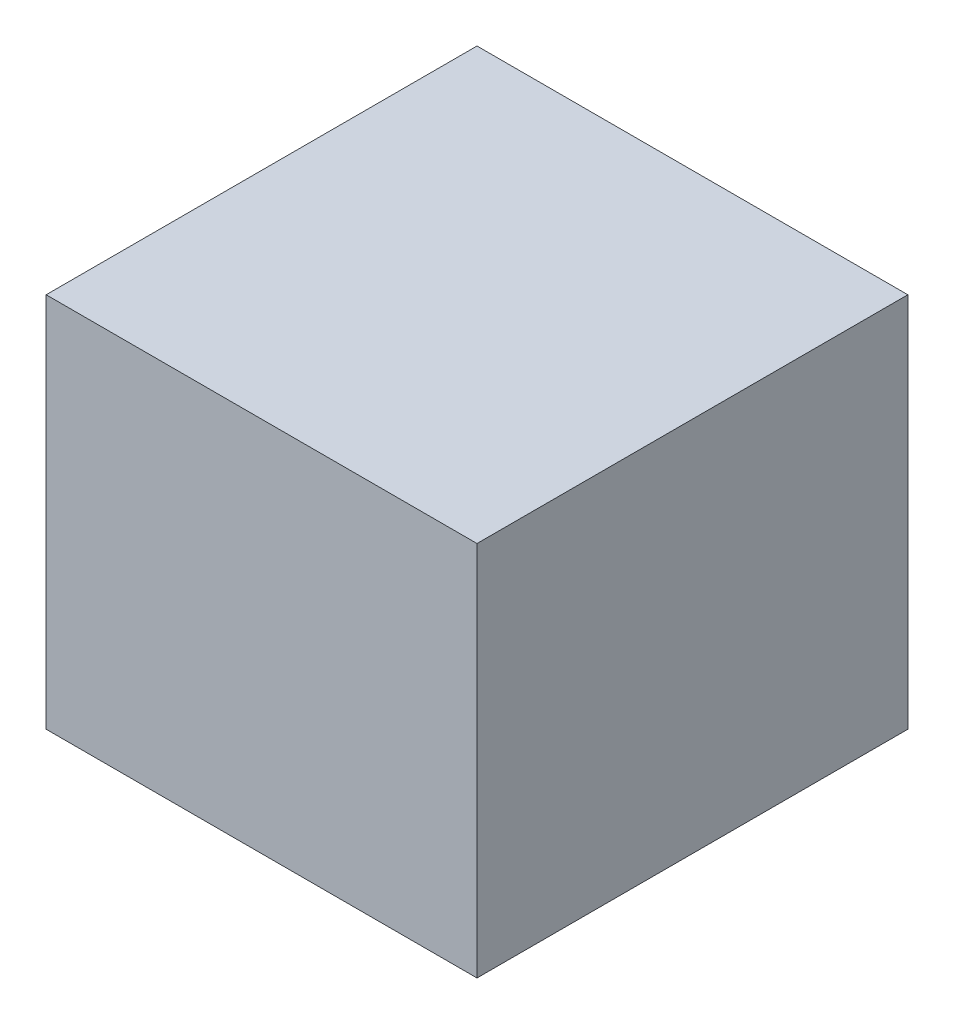
ISO-10303-21;
HEADER;
FILE_DESCRIPTION(('STEP AP214'),'2;1');
FILE_NAME('part.step','',(''),(''),'','','');
FILE_SCHEMA(('AUTOMOTIVE_DESIGN { 1 0 10303 214 1 1 1 1 }'));
ENDSEC;
DATA;
#1=APPLICATION_CONTEXT('core data for automotive mechanical design processes');
#2=APPLICATION_PROTOCOL_DEFINITION('international standard','automotive_design',2000,#1);
#3=PRODUCT_CONTEXT('',#1,'mechanical');
#4=PRODUCT('Part','Part','',(#3));
#5=PRODUCT_RELATED_PRODUCT_CATEGORY('part','',(#4));
#6=PRODUCT_DEFINITION_FORMATION('','',#4);
#7=PRODUCT_DEFINITION_CONTEXT('part definition',#1,'design');
#8=PRODUCT_DEFINITION('design','',#6,#7);
#9=PRODUCT_DEFINITION_SHAPE('','',#8);
#10=(LENGTH_UNIT() NAMED_UNIT(*) SI_UNIT(.MILLI.,.METRE.));
#11=(NAMED_UNIT(*) PLANE_ANGLE_UNIT() SI_UNIT($,.RADIAN.));
#12=(NAMED_UNIT(*) SI_UNIT($,.STERADIAN.) SOLID_ANGLE_UNIT());
#13=UNCERTAINTY_MEASURE_WITH_UNIT(LENGTH_MEASURE(1.E-05),#10,'distance_accuracy_value','');
#14=(GEOMETRIC_REPRESENTATION_CONTEXT(3) GLOBAL_UNCERTAINTY_ASSIGNED_CONTEXT((#13)) GLOBAL_UNIT_ASSIGNED_CONTEXT((#10,
#11,#12)) REPRESENTATION_CONTEXT('',''));
#15=CARTESIAN_POINT('',(0.,0.,0.));
#16=DIRECTION('',(0.,0.,1.));
#17=DIRECTION('',(1.,0.,0.));
#18=AXIS2_PLACEMENT_3D('',#15,#16,#17);
#19=CARTESIAN_POINT('',(0.,0.,-38.1));
#20=DIRECTION('',(-1.,0.,0.));
#21=DIRECTION('',(0.,-1.,0.));
#22=AXIS2_PLACEMENT_3D('',#19,#20,#21);
#23=PLANE('',#22);
#24=DIRECTION('',(0.,-1.,0.));
#25=VECTOR('',#24,1.);
#26=CARTESIAN_POINT('',(0.,0.,0.));
#27=LINE('',#26,#25);
#28=CARTESIAN_POINT('',(0.,33.274,0.));
#29=VERTEX_POINT('',#28);
#30=CARTESIAN_POINT('',(0.,0.,0.));
#31=VERTEX_POINT('',#30);
#32=EDGE_CURVE('E97',#29,#31,#27,.T.);
#33=ORIENTED_EDGE('',*,*,#32,.F.);
#34=DIRECTION('',(0.,0.,1.));
#35=VECTOR('',#34,1.);
#36=CARTESIAN_POINT('',(0.,33.274,-38.1));
#37=LINE('',#36,#35);
#38=CARTESIAN_POINT('',(0.,33.274,-38.1));
#39=VERTEX_POINT('',#38);
#40=EDGE_CURVE('E11',#39,#29,#37,.T.);
#41=ORIENTED_EDGE('',*,*,#40,.F.);
#42=DIRECTION('',(0.,-1.,0.));
#43=VECTOR('',#42,1.);
#44=CARTESIAN_POINT('',(0.,0.,-38.1));
#45=LINE('',#44,#43);
#46=CARTESIAN_POINT('',(0.,0.,-38.1));
#47=VERTEX_POINT('',#46);
#48=EDGE_CURVE('E91',#39,#47,#45,.T.);
#49=ORIENTED_EDGE('',*,*,#48,.T.);
#50=DIRECTION('',(0.,0.,1.));
#51=VECTOR('',#50,1.);
#52=CARTESIAN_POINT('',(0.,0.,-38.1));
#53=LINE('',#52,#51);
#54=EDGE_CURVE('E36',#47,#31,#53,.T.);
#55=ORIENTED_EDGE('',*,*,#54,.T.);
#56=EDGE_LOOP('',(#33,#41,#49,#55));
#57=FACE_BOUND('',#56,.T.);
#58=ADVANCED_FACE('F33',(#57),#23,.T.);
#59=CARTESIAN_POINT('',(0.,33.274,-38.1));
#60=DIRECTION('',(0.,1.,0.));
#61=DIRECTION('',(0.,0.,1.));
#62=AXIS2_PLACEMENT_3D('',#59,#60,#61);
#63=PLANE('',#62);
#64=DIRECTION('',(-1.,0.,0.));
#65=VECTOR('',#64,1.);
#66=CARTESIAN_POINT('',(0.,33.274,0.));
#67=LINE('',#66,#65);
#68=CARTESIAN_POINT('',(38.1,33.274,0.));
#69=VERTEX_POINT('',#68);
#70=EDGE_CURVE('E93',#69,#29,#67,.T.);
#71=ORIENTED_EDGE('',*,*,#70,.F.);
#72=DIRECTION('',(0.,0.,1.));
#73=VECTOR('',#72,1.);
#74=CARTESIAN_POINT('',(38.1,33.274,-38.1));
#75=LINE('',#74,#73);
#76=CARTESIAN_POINT('',(38.1,33.274,-38.1));
#77=VERTEX_POINT('',#76);
#78=EDGE_CURVE('E42',#77,#69,#75,.T.);
#79=ORIENTED_EDGE('',*,*,#78,.F.);
#80=DIRECTION('',(-1.,0.,0.));
#81=VECTOR('',#80,1.);
#82=CARTESIAN_POINT('',(0.,33.274,-38.1));
#83=LINE('',#82,#81);
#84=EDGE_CURVE('E88',#77,#39,#83,.T.);
#85=ORIENTED_EDGE('',*,*,#84,.T.);
#86=ORIENTED_EDGE('',*,*,#40,.T.);
#87=EDGE_LOOP('',(#71,#79,#85,#86));
#88=FACE_BOUND('',#87,.T.);
#89=ADVANCED_FACE('F107',(#88),#63,.T.);
#90=CARTESIAN_POINT('',(38.1,0.,-38.1));
#91=DIRECTION('',(1.,0.,0.));
#92=DIRECTION('',(0.,1.,0.));
#93=AXIS2_PLACEMENT_3D('',#90,#91,#92);
#94=PLANE('',#93);
#95=DIRECTION('',(0.,1.,0.));
#96=VECTOR('',#95,1.);
#97=CARTESIAN_POINT('',(38.1,0.,0.));
#98=LINE('',#97,#96);
#99=CARTESIAN_POINT('',(38.1,0.,0.));
#100=VERTEX_POINT('',#99);
#101=EDGE_CURVE('E83',#100,#69,#98,.T.);
#102=ORIENTED_EDGE('',*,*,#101,.F.);
#103=DIRECTION('',(0.,0.,1.));
#104=VECTOR('',#103,1.);
#105=CARTESIAN_POINT('',(38.1,0.,-38.1));
#106=LINE('',#105,#104);
#107=CARTESIAN_POINT('',(38.1,0.,-38.1));
#108=VERTEX_POINT('',#107);
#109=EDGE_CURVE('E78',#108,#100,#106,.T.);
#110=ORIENTED_EDGE('',*,*,#109,.F.);
#111=DIRECTION('',(0.,1.,0.));
#112=VECTOR('',#111,1.);
#113=CARTESIAN_POINT('',(38.1,0.,-38.1));
#114=LINE('',#113,#112);
#115=EDGE_CURVE('E81',#108,#77,#114,.T.);
#116=ORIENTED_EDGE('',*,*,#115,.T.);
#117=ORIENTED_EDGE('',*,*,#78,.T.);
#118=EDGE_LOOP('',(#102,#110,#116,#117));
#119=FACE_BOUND('',#118,.T.);
#120=ADVANCED_FACE('F80',(#119),#94,.T.);
#121=CARTESIAN_POINT('',(0.,0.,-38.1));
#122=DIRECTION('',(0.,-1.,0.));
#123=DIRECTION('',(0.,0.,-1.));
#124=AXIS2_PLACEMENT_3D('',#121,#122,#123);
#125=PLANE('',#124);
#126=DIRECTION('',(1.,0.,0.));
#127=VECTOR('',#126,1.);
#128=CARTESIAN_POINT('',(0.,0.,0.));
#129=LINE('',#128,#127);
#130=EDGE_CURVE('E100',#31,#100,#129,.T.);
#131=ORIENTED_EDGE('',*,*,#130,.F.);
#132=ORIENTED_EDGE('',*,*,#54,.F.);
#133=DIRECTION('',(1.,0.,0.));
#134=VECTOR('',#133,1.);
#135=CARTESIAN_POINT('',(0.,0.,-38.1));
#136=LINE('',#135,#134);
#137=EDGE_CURVE('E87',#47,#108,#136,.T.);
#138=ORIENTED_EDGE('',*,*,#137,.T.);
#139=ORIENTED_EDGE('',*,*,#109,.T.);
#140=EDGE_LOOP('',(#131,#132,#138,#139));
#141=FACE_BOUND('',#140,.T.);
#142=ADVANCED_FACE('F90',(#141),#125,.T.);
#143=CARTESIAN_POINT('',(0.,0.,-38.1));
#144=DIRECTION('',(0.,0.,-1.));
#145=DIRECTION('',(-1.,0.,0.));
#146=AXIS2_PLACEMENT_3D('',#143,#144,#145);
#147=PLANE('',#146);
#148=ORIENTED_EDGE('',*,*,#48,.F.);
#149=ORIENTED_EDGE('',*,*,#84,.F.);
#150=ORIENTED_EDGE('',*,*,#115,.F.);
#151=ORIENTED_EDGE('',*,*,#137,.F.);
#152=EDGE_LOOP('',(#148,#149,#150,#151));
#153=FACE_BOUND('',#152,.T.);
#154=ADVANCED_FACE('F86',(#153),#147,.T.);
#155=CARTESIAN_POINT('',(0.,0.,0.));
#156=DIRECTION('',(0.,0.,-1.));
#157=DIRECTION('',(-1.,0.,0.));
#158=AXIS2_PLACEMENT_3D('',#155,#156,#157);
#159=PLANE('',#158);
#160=ORIENTED_EDGE('',*,*,#32,.T.);
#161=ORIENTED_EDGE('',*,*,#130,.T.);
#162=ORIENTED_EDGE('',*,*,#101,.T.);
#163=ORIENTED_EDGE('',*,*,#70,.T.);
#164=EDGE_LOOP('',(#160,#161,#162,#163));
#165=FACE_BOUND('',#164,.T.);
#166=ADVANCED_FACE('F106',(#165),#159,.F.);
#167=CLOSED_SHELL('',(#58,#89,#120,#142,#154,#166));
#168=MANIFOLD_SOLID_BREP('B2',#167);
#169=ADVANCED_BREP_SHAPE_REPRESENTATION('',(#18,#168),#14);
#170=SHAPE_DEFINITION_REPRESENTATION(#9,#169);
ENDSEC;
END-ISO-10303-21;
